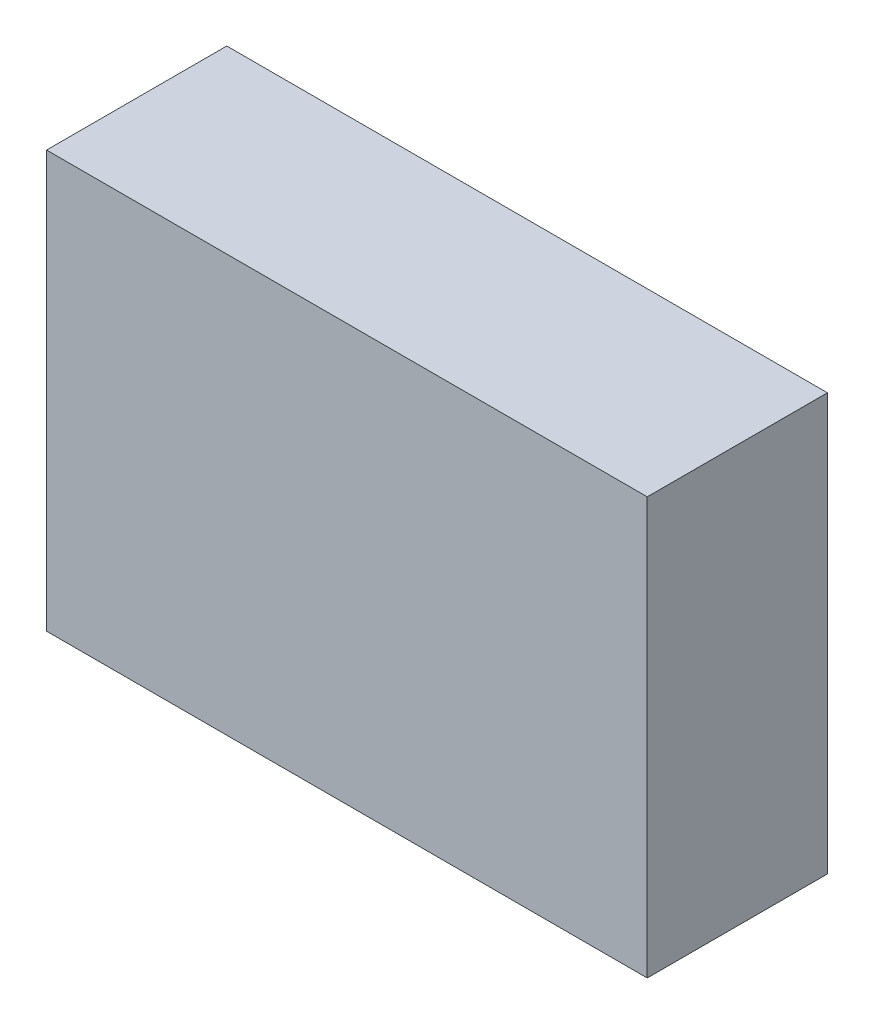
ISO-10303-21;
HEADER;
FILE_DESCRIPTION(('STEP AP214'),'2;1');
FILE_NAME('part.step','',(''),(''),'','','');
FILE_SCHEMA(('AUTOMOTIVE_DESIGN { 1 0 10303 214 1 1 1 1 }'));
ENDSEC;
DATA;
#1=APPLICATION_CONTEXT('core data for automotive mechanical design processes');
#2=APPLICATION_PROTOCOL_DEFINITION('international standard','automotive_design',2000,#1);
#3=PRODUCT_CONTEXT('',#1,'mechanical');
#4=PRODUCT('Part','Part','',(#3));
#5=PRODUCT_RELATED_PRODUCT_CATEGORY('part','',(#4));
#6=PRODUCT_DEFINITION_FORMATION('','',#4);
#7=PRODUCT_DEFINITION_CONTEXT('part definition',#1,'design');
#8=PRODUCT_DEFINITION('design','',#6,#7);
#9=PRODUCT_DEFINITION_SHAPE('','',#8);
#10=(LENGTH_UNIT() NAMED_UNIT(*) SI_UNIT(.MILLI.,.METRE.));
#11=(NAMED_UNIT(*) PLANE_ANGLE_UNIT() SI_UNIT($,.RADIAN.));
#12=(NAMED_UNIT(*) SI_UNIT($,.STERADIAN.) SOLID_ANGLE_UNIT());
#13=UNCERTAINTY_MEASURE_WITH_UNIT(LENGTH_MEASURE(1.E-05),#10,'distance_accuracy_value','');
#14=(GEOMETRIC_REPRESENTATION_CONTEXT(3) GLOBAL_UNCERTAINTY_ASSIGNED_CONTEXT((#13)) GLOBAL_UNIT_ASSIGNED_CONTEXT((#10,
#11,#12)) REPRESENTATION_CONTEXT('',''));
#15=CARTESIAN_POINT('',(0.,0.,0.));
#16=DIRECTION('',(0.,0.,1.));
#17=DIRECTION('',(1.,0.,0.));
#18=AXIS2_PLACEMENT_3D('',#15,#16,#17);
#19=CARTESIAN_POINT('',(127.,-44.053125,-19.05));
#20=DIRECTION('',(0.,-1.,0.));
#21=DIRECTION('',(0.,0.,-1.));
#22=AXIS2_PLACEMENT_3D('',#19,#20,#21);
#23=PLANE('',#22);
#24=DIRECTION('',(0.,0.,1.));
#25=VECTOR('',#24,1.);
#26=CARTESIAN_POINT('',(0.,-44.053125,-19.05));
#27=LINE('',#26,#25);
#28=CARTESIAN_POINT('',(0.,-44.053125,-19.05));
#29=VERTEX_POINT('',#28);
#30=CARTESIAN_POINT('',(0.,-44.053125,19.05));
#31=VERTEX_POINT('',#30);
#32=EDGE_CURVE('E102',#29,#31,#27,.T.);
#33=ORIENTED_EDGE('',*,*,#32,.F.);
#34=DIRECTION('',(-1.,0.,0.));
#35=VECTOR('',#34,1.);
#36=CARTESIAN_POINT('',(127.,-44.053125,-19.05));
#37=LINE('',#36,#35);
#38=CARTESIAN_POINT('',(127.,-44.053125,-19.05));
#39=VERTEX_POINT('',#38);
#40=EDGE_CURVE('E11',#39,#29,#37,.T.);
#41=ORIENTED_EDGE('',*,*,#40,.F.);
#42=DIRECTION('',(0.,0.,1.));
#43=VECTOR('',#42,1.);
#44=CARTESIAN_POINT('',(127.,-44.053125,-19.05));
#45=LINE('',#44,#43);
#46=CARTESIAN_POINT('',(127.,-44.053125,19.05));
#47=VERTEX_POINT('',#46);
#48=EDGE_CURVE('E97',#39,#47,#45,.T.);
#49=ORIENTED_EDGE('',*,*,#48,.T.);
#50=DIRECTION('',(-1.,0.,0.));
#51=VECTOR('',#50,1.);
#52=CARTESIAN_POINT('',(127.,-44.053125,19.05));
#53=LINE('',#52,#51);
#54=EDGE_CURVE('E40',#47,#31,#53,.T.);
#55=ORIENTED_EDGE('',*,*,#54,.T.);
#56=EDGE_LOOP('',(#33,#41,#49,#55));
#57=FACE_BOUND('',#56,.T.);
#58=ADVANCED_FACE('F37',(#57),#23,.T.);
#59=CARTESIAN_POINT('',(127.,-44.053125,-19.05));
#60=DIRECTION('',(0.,0.,1.));
#61=DIRECTION('',(1.,0.,0.));
#62=AXIS2_PLACEMENT_3D('',#59,#60,#61);
#63=PLANE('',#62);
#64=DIRECTION('',(0.,1.,0.));
#65=VECTOR('',#64,1.);
#66=CARTESIAN_POINT('',(0.,-44.053125,-19.05));
#67=LINE('',#66,#65);
#68=CARTESIAN_POINT('',(0.,44.053125,-19.05));
#69=VERTEX_POINT('',#68);
#70=EDGE_CURVE('E70',#29,#69,#67,.T.);
#71=ORIENTED_EDGE('',*,*,#70,.T.);
#72=DIRECTION('',(-1.,0.,0.));
#73=VECTOR('',#72,1.);
#74=CARTESIAN_POINT('',(127.,44.053125,-19.05));
#75=LINE('',#74,#73);
#76=CARTESIAN_POINT('',(127.,44.053125,-19.05));
#77=VERTEX_POINT('',#76);
#78=EDGE_CURVE('E46',#77,#69,#75,.T.);
#79=ORIENTED_EDGE('',*,*,#78,.F.);
#80=DIRECTION('',(0.,1.,0.));
#81=VECTOR('',#80,1.);
#82=CARTESIAN_POINT('',(127.,-44.053125,-19.05));
#83=LINE('',#82,#81);
#84=EDGE_CURVE('E87',#39,#77,#83,.T.);
#85=ORIENTED_EDGE('',*,*,#84,.F.);
#86=ORIENTED_EDGE('',*,*,#40,.T.);
#87=EDGE_LOOP('',(#71,#79,#85,#86));
#88=FACE_BOUND('',#87,.T.);
#89=ADVANCED_FACE('F112',(#88),#63,.F.);
#90=CARTESIAN_POINT('',(127.,44.053125,-19.05));
#91=DIRECTION('',(0.,-1.,0.));
#92=DIRECTION('',(0.,0.,-1.));
#93=AXIS2_PLACEMENT_3D('',#90,#91,#92);
#94=PLANE('',#93);
#95=DIRECTION('',(0.,0.,1.));
#96=VECTOR('',#95,1.);
#97=CARTESIAN_POINT('',(0.,44.053125,-19.05));
#98=LINE('',#97,#96);
#99=CARTESIAN_POINT('',(0.,44.053125,19.05));
#100=VERTEX_POINT('',#99);
#101=EDGE_CURVE('E94',#69,#100,#98,.T.);
#102=ORIENTED_EDGE('',*,*,#101,.T.);
#103=DIRECTION('',(-1.,0.,0.));
#104=VECTOR('',#103,1.);
#105=CARTESIAN_POINT('',(127.,44.053125,19.05));
#106=LINE('',#105,#104);
#107=CARTESIAN_POINT('',(127.,44.053125,19.05));
#108=VERTEX_POINT('',#107);
#109=EDGE_CURVE('E91',#108,#100,#106,.T.);
#110=ORIENTED_EDGE('',*,*,#109,.F.);
#111=DIRECTION('',(0.,0.,1.));
#112=VECTOR('',#111,1.);
#113=CARTESIAN_POINT('',(127.,44.053125,-19.05));
#114=LINE('',#113,#112);
#115=EDGE_CURVE('E82',#77,#108,#114,.T.);
#116=ORIENTED_EDGE('',*,*,#115,.F.);
#117=ORIENTED_EDGE('',*,*,#78,.T.);
#118=EDGE_LOOP('',(#102,#110,#116,#117));
#119=FACE_BOUND('',#118,.T.);
#120=ADVANCED_FACE('F92',(#119),#94,.F.);
#121=CARTESIAN_POINT('',(127.,-44.053125,19.05));
#122=DIRECTION('',(0.,0.,1.));
#123=DIRECTION('',(1.,0.,0.));
#124=AXIS2_PLACEMENT_3D('',#121,#122,#123);
#125=PLANE('',#124);
#126=DIRECTION('',(0.,1.,0.));
#127=VECTOR('',#126,1.);
#128=CARTESIAN_POINT('',(0.,-44.053125,19.05));
#129=LINE('',#128,#127);
#130=EDGE_CURVE('E105',#31,#100,#129,.T.);
#131=ORIENTED_EDGE('',*,*,#130,.F.);
#132=ORIENTED_EDGE('',*,*,#54,.F.);
#133=DIRECTION('',(0.,1.,0.));
#134=VECTOR('',#133,1.);
#135=CARTESIAN_POINT('',(127.,-44.053125,19.05));
#136=LINE('',#135,#134);
#137=EDGE_CURVE('E86',#47,#108,#136,.T.);
#138=ORIENTED_EDGE('',*,*,#137,.T.);
#139=ORIENTED_EDGE('',*,*,#109,.T.);
#140=EDGE_LOOP('',(#131,#132,#138,#139));
#141=FACE_BOUND('',#140,.T.);
#142=ADVANCED_FACE('F96',(#141),#125,.T.);
#143=CARTESIAN_POINT('',(127.,0.,0.));
#144=DIRECTION('',(-1.,0.,0.));
#145=DIRECTION('',(0.,0.,1.));
#146=AXIS2_PLACEMENT_3D('',#143,#144,#145);
#147=PLANE('',#146);
#148=ORIENTED_EDGE('',*,*,#48,.F.);
#149=ORIENTED_EDGE('',*,*,#84,.T.);
#150=ORIENTED_EDGE('',*,*,#115,.T.);
#151=ORIENTED_EDGE('',*,*,#137,.F.);
#152=EDGE_LOOP('',(#148,#149,#150,#151));
#153=FACE_BOUND('',#152,.T.);
#154=ADVANCED_FACE('F85',(#153),#147,.F.);
#155=CARTESIAN_POINT('',(0.,0.,0.));
#156=DIRECTION('',(-1.,0.,0.));
#157=DIRECTION('',(0.,0.,1.));
#158=AXIS2_PLACEMENT_3D('',#155,#156,#157);
#159=PLANE('',#158);
#160=ORIENTED_EDGE('',*,*,#32,.T.);
#161=ORIENTED_EDGE('',*,*,#130,.T.);
#162=ORIENTED_EDGE('',*,*,#101,.F.);
#163=ORIENTED_EDGE('',*,*,#70,.F.);
#164=EDGE_LOOP('',(#160,#161,#162,#163));
#165=FACE_BOUND('',#164,.T.);
#166=ADVANCED_FACE('F110',(#165),#159,.T.);
#167=CLOSED_SHELL('',(#58,#89,#120,#142,#154,#166));
#168=MANIFOLD_SOLID_BREP('B2',#167);
#169=ADVANCED_BREP_SHAPE_REPRESENTATION('',(#18,#168),#14);
#170=SHAPE_DEFINITION_REPRESENTATION(#9,#169);
ENDSEC;
END-ISO-10303-21;
